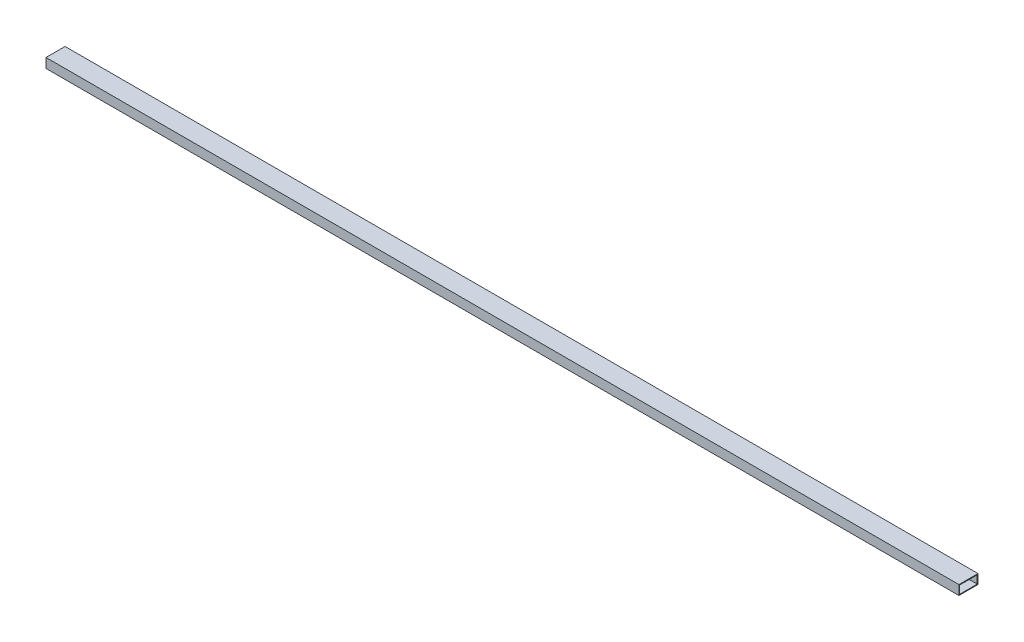
ISO-10303-21;
HEADER;
FILE_DESCRIPTION(('STEP AP214'),'2;1');
FILE_NAME('part.step','',(''),(''),'','','');
FILE_SCHEMA(('AUTOMOTIVE_DESIGN { 1 0 10303 214 1 1 1 1 }'));
ENDSEC;
DATA;
#1=APPLICATION_CONTEXT('core data for automotive mechanical design processes');
#2=APPLICATION_PROTOCOL_DEFINITION('international standard','automotive_design',2000,#1);
#3=PRODUCT_CONTEXT('',#1,'mechanical');
#4=PRODUCT('Part','Part','',(#3));
#5=PRODUCT_RELATED_PRODUCT_CATEGORY('part','',(#4));
#6=PRODUCT_DEFINITION_FORMATION('','',#4);
#7=PRODUCT_DEFINITION_CONTEXT('part definition',#1,'design');
#8=PRODUCT_DEFINITION('design','',#6,#7);
#9=PRODUCT_DEFINITION_SHAPE('','',#8);
#10=(LENGTH_UNIT() NAMED_UNIT(*) SI_UNIT(.MILLI.,.METRE.));
#11=(NAMED_UNIT(*) PLANE_ANGLE_UNIT() SI_UNIT($,.RADIAN.));
#12=(NAMED_UNIT(*) SI_UNIT($,.STERADIAN.) SOLID_ANGLE_UNIT());
#13=UNCERTAINTY_MEASURE_WITH_UNIT(LENGTH_MEASURE(1.E-05),#10,'distance_accuracy_value','');
#14=(GEOMETRIC_REPRESENTATION_CONTEXT(3) GLOBAL_UNCERTAINTY_ASSIGNED_CONTEXT((#13)) GLOBAL_UNIT_ASSIGNED_CONTEXT((#10,
#11,#12)) REPRESENTATION_CONTEXT('',''));
#15=CARTESIAN_POINT('',(0.,0.,0.));
#16=DIRECTION('',(0.,0.,1.));
#17=DIRECTION('',(1.,0.,0.));
#18=AXIS2_PLACEMENT_3D('',#15,#16,#17);
#19=CARTESIAN_POINT('',(4788.,-2.273736754432E-13,4.547473508865E-13));
#20=DIRECTION('',(1.,0.,0.));
#21=DIRECTION('',(0.,0.,1.));
#22=AXIS2_PLACEMENT_3D('',#19,#20,#21);
#23=PLANE('',#22);
#24=DIRECTION('',(0.,0.,-1.));
#25=VECTOR('',#24,1.);
#26=CARTESIAN_POINT('',(4788.,-21.,46.));
#27=LINE('',#26,#25);
#28=CARTESIAN_POINT('',(4788.,-21.,46.));
#29=VERTEX_POINT('',#28);
#30=CARTESIAN_POINT('',(4788.,-21.,-46.));
#31=VERTEX_POINT('',#30);
#32=EDGE_CURVE('E116',#29,#31,#27,.T.);
#33=ORIENTED_EDGE('',*,*,#32,.F.);
#34=DIRECTION('',(0.,-1.,0.));
#35=VECTOR('',#34,1.);
#36=CARTESIAN_POINT('',(4788.,21.,46.));
#37=LINE('',#36,#35);
#38=CARTESIAN_POINT('',(4788.,21.,46.));
#39=VERTEX_POINT('',#38);
#40=EDGE_CURVE('E103',#39,#29,#37,.T.);
#41=ORIENTED_EDGE('',*,*,#40,.F.);
#42=DIRECTION('',(0.,0.,1.));
#43=VECTOR('',#42,1.);
#44=CARTESIAN_POINT('',(4788.,21.,-46.));
#45=LINE('',#44,#43);
#46=CARTESIAN_POINT('',(4788.,21.,-46.));
#47=VERTEX_POINT('',#46);
#48=EDGE_CURVE('E161',#47,#39,#45,.T.);
#49=ORIENTED_EDGE('',*,*,#48,.F.);
#50=DIRECTION('',(0.,1.,0.));
#51=VECTOR('',#50,1.);
#52=CARTESIAN_POINT('',(4788.,-21.,-46.));
#53=LINE('',#52,#51);
#54=EDGE_CURVE('E25',#31,#47,#53,.T.);
#55=ORIENTED_EDGE('',*,*,#54,.F.);
#56=EDGE_LOOP('',(#33,#41,#49,#55));
#57=FACE_BOUND('',#56,.T.);
#58=DIRECTION('',(0.,1.,0.));
#59=VECTOR('',#58,1.);
#60=CARTESIAN_POINT('',(4788.,-25.,-50.));
#61=LINE('',#60,#59);
#62=CARTESIAN_POINT('',(4788.,-25.,-50.));
#63=VERTEX_POINT('',#62);
#64=CARTESIAN_POINT('',(4788.,25.,-50.));
#65=VERTEX_POINT('',#64);
#66=EDGE_CURVE('E174',#63,#65,#61,.T.);
#67=ORIENTED_EDGE('',*,*,#66,.T.);
#68=DIRECTION('',(0.,0.,1.));
#69=VECTOR('',#68,1.);
#70=CARTESIAN_POINT('',(4788.,25.,-50.));
#71=LINE('',#70,#69);
#72=CARTESIAN_POINT('',(4788.,25.,50.));
#73=VERTEX_POINT('',#72);
#74=EDGE_CURVE('E140',#65,#73,#71,.T.);
#75=ORIENTED_EDGE('',*,*,#74,.T.);
#76=DIRECTION('',(0.,-1.,0.));
#77=VECTOR('',#76,1.);
#78=CARTESIAN_POINT('',(4788.,25.,50.));
#79=LINE('',#78,#77);
#80=CARTESIAN_POINT('',(4788.,-25.,50.));
#81=VERTEX_POINT('',#80);
#82=EDGE_CURVE('E139',#73,#81,#79,.T.);
#83=ORIENTED_EDGE('',*,*,#82,.T.);
#84=DIRECTION('',(0.,0.,-1.));
#85=VECTOR('',#84,1.);
#86=CARTESIAN_POINT('',(4788.,-25.,50.));
#87=LINE('',#86,#85);
#88=EDGE_CURVE('E127',#81,#63,#87,.T.);
#89=ORIENTED_EDGE('',*,*,#88,.T.);
#90=EDGE_LOOP('',(#67,#75,#83,#89));
#91=FACE_BOUND('',#90,.T.);
#92=ADVANCED_FACE('F17',(#57,#91),#23,.T.);
#93=CARTESIAN_POINT('',(-4.547473508865E-13,2.273736754432E-13,4.547473508865E-13));
#94=DIRECTION('',(1.,0.,0.));
#95=DIRECTION('',(0.,0.,1.));
#96=AXIS2_PLACEMENT_3D('',#93,#94,#95);
#97=PLANE('',#96);
#98=DIRECTION('',(0.,1.,0.));
#99=VECTOR('',#98,1.);
#100=CARTESIAN_POINT('',(0.,-21.,-46.));
#101=LINE('',#100,#99);
#102=CARTESIAN_POINT('',(0.,-21.,-46.));
#103=VERTEX_POINT('',#102);
#104=CARTESIAN_POINT('',(0.,21.,-46.));
#105=VERTEX_POINT('',#104);
#106=EDGE_CURVE('E11',#103,#105,#101,.T.);
#107=ORIENTED_EDGE('',*,*,#106,.T.);
#108=DIRECTION('',(0.,0.,1.));
#109=VECTOR('',#108,1.);
#110=CARTESIAN_POINT('',(0.,21.,-46.));
#111=LINE('',#110,#109);
#112=CARTESIAN_POINT('',(0.,21.,46.));
#113=VERTEX_POINT('',#112);
#114=EDGE_CURVE('E163',#105,#113,#111,.T.);
#115=ORIENTED_EDGE('',*,*,#114,.T.);
#116=DIRECTION('',(0.,-1.,0.));
#117=VECTOR('',#116,1.);
#118=CARTESIAN_POINT('',(0.,21.,46.));
#119=LINE('',#118,#117);
#120=CARTESIAN_POINT('',(0.,-21.,46.));
#121=VERTEX_POINT('',#120);
#122=EDGE_CURVE('E113',#113,#121,#119,.T.);
#123=ORIENTED_EDGE('',*,*,#122,.T.);
#124=DIRECTION('',(0.,0.,-1.));
#125=VECTOR('',#124,1.);
#126=CARTESIAN_POINT('',(0.,-21.,46.));
#127=LINE('',#126,#125);
#128=EDGE_CURVE('E125',#121,#103,#127,.T.);
#129=ORIENTED_EDGE('',*,*,#128,.T.);
#130=EDGE_LOOP('',(#107,#115,#123,#129));
#131=FACE_BOUND('',#130,.T.);
#132=DIRECTION('',(0.,0.,-1.));
#133=VECTOR('',#132,1.);
#134=CARTESIAN_POINT('',(-9.094947017729E-13,-25.,50.));
#135=LINE('',#134,#133);
#136=CARTESIAN_POINT('',(-9.094947017729E-13,-25.,50.));
#137=VERTEX_POINT('',#136);
#138=CARTESIAN_POINT('',(0.,-25.,-50.));
#139=VERTEX_POINT('',#138);
#140=EDGE_CURVE('E133',#137,#139,#135,.T.);
#141=ORIENTED_EDGE('',*,*,#140,.F.);
#142=DIRECTION('',(0.,-1.,0.));
#143=VECTOR('',#142,1.);
#144=CARTESIAN_POINT('',(-9.094947017729E-13,25.,50.));
#145=LINE('',#144,#143);
#146=CARTESIAN_POINT('',(-9.094947017729E-13,25.,50.));
#147=VERTEX_POINT('',#146);
#148=EDGE_CURVE('E144',#147,#137,#145,.T.);
#149=ORIENTED_EDGE('',*,*,#148,.F.);
#150=DIRECTION('',(0.,0.,1.));
#151=VECTOR('',#150,1.);
#152=CARTESIAN_POINT('',(0.,25.,-50.));
#153=LINE('',#152,#151);
#154=CARTESIAN_POINT('',(0.,25.,-50.));
#155=VERTEX_POINT('',#154);
#156=EDGE_CURVE('E176',#155,#147,#153,.T.);
#157=ORIENTED_EDGE('',*,*,#156,.F.);
#158=DIRECTION('',(0.,1.,0.));
#159=VECTOR('',#158,1.);
#160=CARTESIAN_POINT('',(0.,-25.,-50.));
#161=LINE('',#160,#159);
#162=EDGE_CURVE('E195',#139,#155,#161,.T.);
#163=ORIENTED_EDGE('',*,*,#162,.F.);
#164=EDGE_LOOP('',(#141,#149,#157,#163));
#165=FACE_BOUND('',#164,.T.);
#166=ADVANCED_FACE('F204',(#131,#165),#97,.F.);
#167=CARTESIAN_POINT('',(0.,-21.,-46.));
#168=DIRECTION('',(0.,0.,1.));
#169=DIRECTION('',(0.,-1.,0.));
#170=AXIS2_PLACEMENT_3D('',#167,#168,#169);
#171=PLANE('',#170);
#172=DIRECTION('',(1.,0.,0.));
#173=VECTOR('',#172,1.);
#174=CARTESIAN_POINT('',(0.,-21.,-46.));
#175=LINE('',#174,#173);
#176=EDGE_CURVE('E121',#103,#31,#175,.T.);
#177=ORIENTED_EDGE('',*,*,#176,.T.);
#178=ORIENTED_EDGE('',*,*,#54,.T.);
#179=DIRECTION('',(1.,0.,0.));
#180=VECTOR('',#179,1.);
#181=CARTESIAN_POINT('',(0.,21.,-46.));
#182=LINE('',#181,#180);
#183=EDGE_CURVE('E158',#105,#47,#182,.T.);
#184=ORIENTED_EDGE('',*,*,#183,.F.);
#185=ORIENTED_EDGE('',*,*,#106,.F.);
#186=EDGE_LOOP('',(#177,#178,#184,#185));
#187=FACE_BOUND('',#186,.T.);
#188=ADVANCED_FACE('F208',(#187),#171,.T.);
#189=CARTESIAN_POINT('',(0.,21.,-46.));
#190=DIRECTION('',(0.,-1.,0.));
#191=DIRECTION('',(-1.,0.,0.));
#192=AXIS2_PLACEMENT_3D('',#189,#190,#191);
#193=PLANE('',#192);
#194=ORIENTED_EDGE('',*,*,#183,.T.);
#195=ORIENTED_EDGE('',*,*,#48,.T.);
#196=DIRECTION('',(1.,0.,0.));
#197=VECTOR('',#196,1.);
#198=CARTESIAN_POINT('',(0.,21.,46.));
#199=LINE('',#198,#197);
#200=EDGE_CURVE('E110',#113,#39,#199,.T.);
#201=ORIENTED_EDGE('',*,*,#200,.F.);
#202=ORIENTED_EDGE('',*,*,#114,.F.);
#203=EDGE_LOOP('',(#194,#195,#201,#202));
#204=FACE_BOUND('',#203,.T.);
#205=ADVANCED_FACE('F207',(#204),#193,.T.);
#206=CARTESIAN_POINT('',(0.,21.,46.));
#207=DIRECTION('',(0.,0.,-1.));
#208=DIRECTION('',(-1.,0.,0.));
#209=AXIS2_PLACEMENT_3D('',#206,#207,#208);
#210=PLANE('',#209);
#211=ORIENTED_EDGE('',*,*,#200,.T.);
#212=ORIENTED_EDGE('',*,*,#40,.T.);
#213=DIRECTION('',(1.,0.,0.));
#214=VECTOR('',#213,1.);
#215=CARTESIAN_POINT('',(0.,-21.,46.));
#216=LINE('',#215,#214);
#217=EDGE_CURVE('E108',#121,#29,#216,.T.);
#218=ORIENTED_EDGE('',*,*,#217,.F.);
#219=ORIENTED_EDGE('',*,*,#122,.F.);
#220=EDGE_LOOP('',(#211,#212,#218,#219));
#221=FACE_BOUND('',#220,.T.);
#222=ADVANCED_FACE('F105',(#221),#210,.T.);
#223=CARTESIAN_POINT('',(0.,-21.,46.));
#224=DIRECTION('',(0.,1.,0.));
#225=DIRECTION('',(1.,0.,0.));
#226=AXIS2_PLACEMENT_3D('',#223,#224,#225);
#227=PLANE('',#226);
#228=ORIENTED_EDGE('',*,*,#217,.T.);
#229=ORIENTED_EDGE('',*,*,#32,.T.);
#230=ORIENTED_EDGE('',*,*,#176,.F.);
#231=ORIENTED_EDGE('',*,*,#128,.F.);
#232=EDGE_LOOP('',(#228,#229,#230,#231));
#233=FACE_BOUND('',#232,.T.);
#234=ADVANCED_FACE('F124',(#233),#227,.T.);
#235=CARTESIAN_POINT('',(-9.094947017729E-13,-25.,50.));
#236=DIRECTION('',(0.,1.,0.));
#237=DIRECTION('',(1.,0.,0.));
#238=AXIS2_PLACEMENT_3D('',#235,#236,#237);
#239=PLANE('',#238);
#240=ORIENTED_EDGE('',*,*,#140,.T.);
#241=DIRECTION('',(1.,0.,0.));
#242=VECTOR('',#241,1.);
#243=CARTESIAN_POINT('',(0.,-25.,-50.));
#244=LINE('',#243,#242);
#245=EDGE_CURVE('E178',#139,#63,#244,.T.);
#246=ORIENTED_EDGE('',*,*,#245,.T.);
#247=ORIENTED_EDGE('',*,*,#88,.F.);
#248=DIRECTION('',(1.,0.,0.));
#249=VECTOR('',#248,1.);
#250=CARTESIAN_POINT('',(-9.094947017729E-13,-25.,50.));
#251=LINE('',#250,#249);
#252=EDGE_CURVE('E145',#137,#81,#251,.T.);
#253=ORIENTED_EDGE('',*,*,#252,.F.);
#254=EDGE_LOOP('',(#240,#246,#247,#253));
#255=FACE_BOUND('',#254,.T.);
#256=ADVANCED_FACE('F261',(#255),#239,.F.);
#257=CARTESIAN_POINT('',(-9.094947017729E-13,25.,50.));
#258=DIRECTION('',(0.,0.,-1.));
#259=DIRECTION('',(-1.,0.,0.));
#260=AXIS2_PLACEMENT_3D('',#257,#258,#259);
#261=PLANE('',#260);
#262=ORIENTED_EDGE('',*,*,#148,.T.);
#263=ORIENTED_EDGE('',*,*,#252,.T.);
#264=ORIENTED_EDGE('',*,*,#82,.F.);
#265=DIRECTION('',(1.,0.,0.));
#266=VECTOR('',#265,1.);
#267=CARTESIAN_POINT('',(-9.094947017729E-13,25.,50.));
#268=LINE('',#267,#266);
#269=EDGE_CURVE('E137',#147,#73,#268,.T.);
#270=ORIENTED_EDGE('',*,*,#269,.F.);
#271=EDGE_LOOP('',(#262,#263,#264,#270));
#272=FACE_BOUND('',#271,.T.);
#273=ADVANCED_FACE('F268',(#272),#261,.F.);
#274=CARTESIAN_POINT('',(0.,25.,-50.));
#275=DIRECTION('',(0.,-1.,0.));
#276=DIRECTION('',(-1.,0.,0.));
#277=AXIS2_PLACEMENT_3D('',#274,#275,#276);
#278=PLANE('',#277);
#279=ORIENTED_EDGE('',*,*,#156,.T.);
#280=ORIENTED_EDGE('',*,*,#269,.T.);
#281=ORIENTED_EDGE('',*,*,#74,.F.);
#282=DIRECTION('',(1.,0.,0.));
#283=VECTOR('',#282,1.);
#284=CARTESIAN_POINT('',(0.,25.,-50.));
#285=LINE('',#284,#283);
#286=EDGE_CURVE('E191',#155,#65,#285,.T.);
#287=ORIENTED_EDGE('',*,*,#286,.F.);
#288=EDGE_LOOP('',(#279,#280,#281,#287));
#289=FACE_BOUND('',#288,.T.);
#290=ADVANCED_FACE('F276',(#289),#278,.F.);
#291=CARTESIAN_POINT('',(0.,-25.,-50.));
#292=DIRECTION('',(0.,0.,1.));
#293=DIRECTION('',(0.,-1.,0.));
#294=AXIS2_PLACEMENT_3D('',#291,#292,#293);
#295=PLANE('',#294);
#296=ORIENTED_EDGE('',*,*,#162,.T.);
#297=ORIENTED_EDGE('',*,*,#286,.T.);
#298=ORIENTED_EDGE('',*,*,#66,.F.);
#299=ORIENTED_EDGE('',*,*,#245,.F.);
#300=EDGE_LOOP('',(#296,#297,#298,#299));
#301=FACE_BOUND('',#300,.T.);
#302=ADVANCED_FACE('F285',(#301),#295,.F.);
#303=CLOSED_SHELL('',(#92,#166,#188,#205,#222,#234,#256,#273,#290,#302));
#304=MANIFOLD_SOLID_BREP('B1',#303);
#305=ADVANCED_BREP_SHAPE_REPRESENTATION('',(#18,#304),#14);
#306=SHAPE_DEFINITION_REPRESENTATION(#9,#305);
ENDSEC;
END-ISO-10303-21;
